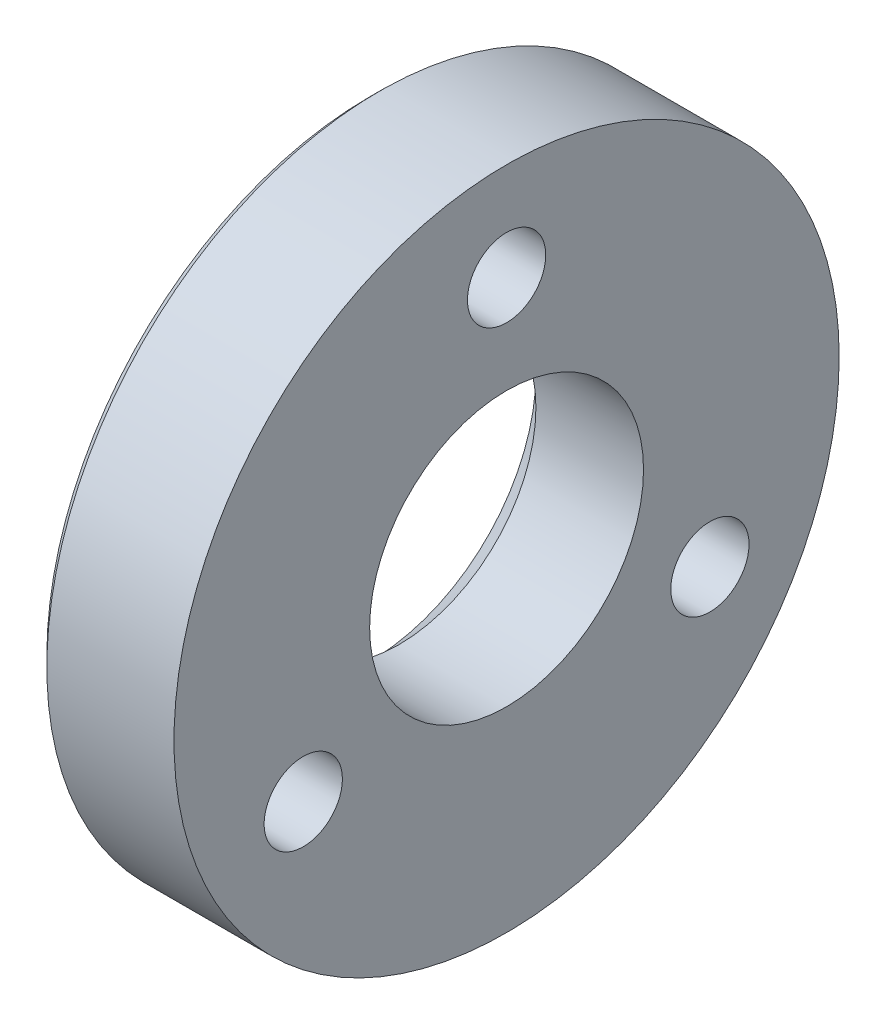
ISO-10303-21;
HEADER;
FILE_DESCRIPTION(('STEP AP214'),'2;1');
FILE_NAME('part.step','',(''),(''),'','','');
FILE_SCHEMA(('AUTOMOTIVE_DESIGN { 1 0 10303 214 1 1 1 1 }'));
ENDSEC;
DATA;
#1=APPLICATION_CONTEXT('core data for automotive mechanical design processes');
#2=APPLICATION_PROTOCOL_DEFINITION('international standard','automotive_design',2000,#1);
#3=PRODUCT_CONTEXT('',#1,'mechanical');
#4=PRODUCT('Part','Part','',(#3));
#5=PRODUCT_RELATED_PRODUCT_CATEGORY('part','',(#4));
#6=PRODUCT_DEFINITION_FORMATION('','',#4);
#7=PRODUCT_DEFINITION_CONTEXT('part definition',#1,'design');
#8=PRODUCT_DEFINITION('design','',#6,#7);
#9=PRODUCT_DEFINITION_SHAPE('','',#8);
#10=(LENGTH_UNIT() NAMED_UNIT(*) SI_UNIT(.MILLI.,.METRE.));
#11=(NAMED_UNIT(*) PLANE_ANGLE_UNIT() SI_UNIT($,.RADIAN.));
#12=(NAMED_UNIT(*) SI_UNIT($,.STERADIAN.) SOLID_ANGLE_UNIT());
#13=UNCERTAINTY_MEASURE_WITH_UNIT(LENGTH_MEASURE(1.E-05),#10,'distance_accuracy_value','');
#14=(GEOMETRIC_REPRESENTATION_CONTEXT(3) GLOBAL_UNCERTAINTY_ASSIGNED_CONTEXT((#13)) GLOBAL_UNIT_ASSIGNED_CONTEXT((#10,
#11,#12)) REPRESENTATION_CONTEXT('',''));
#15=CARTESIAN_POINT('',(0.,0.,0.));
#16=DIRECTION('',(0.,0.,1.));
#17=DIRECTION('',(1.,0.,0.));
#18=AXIS2_PLACEMENT_3D('',#15,#16,#17);
#19=CARTESIAN_POINT('',(-1.2E-05,-6.00000000000005,-10.3923048454132));
#20=DIRECTION('',(1.,0.,0.));
#21=DIRECTION('',(0.,0.,-1.));
#22=AXIS2_PLACEMENT_3D('',#19,#20,#21);
#23=CYLINDRICAL_SURFACE('',#22,2.);
#24=CARTESIAN_POINT('',(7.,-6.00000000000005,-10.3923048454132));
#25=DIRECTION('',(1.,0.,0.));
#26=DIRECTION('',(0.,0.,-1.));
#27=AXIS2_PLACEMENT_3D('',#24,#25,#26);
#28=CIRCLE('',#27,2.);
#29=CARTESIAN_POINT('',(7.,-6.00000000000005,-12.3923048454132));
#30=VERTEX_POINT('',#29);
#31=EDGE_CURVE('E64',#30,#30,#28,.T.);
#32=CARTESIAN_POINT('',(3.,-6.00000000000005,-10.3923048454132));
#33=DIRECTION('',(-1.,0.,0.));
#34=DIRECTION('',(0.,0.,1.));
#35=AXIS2_PLACEMENT_3D('',#32,#33,#34);
#36=CIRCLE('',#35,2.);
#37=CARTESIAN_POINT('',(3.,-6.00000000000005,-12.3923048454132));
#38=VERTEX_POINT('',#37);
#39=EDGE_CURVE('E68',#38,#38,#36,.F.);
#40=CARTESIAN_POINT('',(7.,-6.00000000000005,-12.3923048454132));
#41=CARTESIAN_POINT('',(6.95833333333333,-6.00000000000005,-12.3923048454132));
#42=CARTESIAN_POINT('',(6.91666666666667,-6.00000000000005,-12.3923048454132));
#43=CARTESIAN_POINT('',(6.83333333333333,-6.00000000000005,-12.3923048454132));
#44=CARTESIAN_POINT('',(6.79166666666667,-6.00000000000005,-12.3923048454132));
#45=CARTESIAN_POINT('',(6.70833333333333,-6.00000000000005,-12.3923048454132));
#46=CARTESIAN_POINT('',(6.66666666666667,-6.00000000000005,-12.3923048454132));
#47=CARTESIAN_POINT('',(6.58333333333333,-6.00000000000005,-12.3923048454132));
#48=CARTESIAN_POINT('',(6.54166666666667,-6.00000000000005,-12.3923048454132));
#49=CARTESIAN_POINT('',(6.45833333333333,-6.00000000000005,-12.3923048454132));
#50=CARTESIAN_POINT('',(6.41666666666667,-6.00000000000005,-12.3923048454132));
#51=CARTESIAN_POINT('',(6.33333333333333,-6.00000000000005,-12.3923048454132));
#52=CARTESIAN_POINT('',(6.29166666666667,-6.00000000000005,-12.3923048454132));
#53=CARTESIAN_POINT('',(6.20833333333333,-6.00000000000005,-12.3923048454132));
#54=CARTESIAN_POINT('',(6.16666666666667,-6.00000000000005,-12.3923048454132));
#55=CARTESIAN_POINT('',(6.08333333333333,-6.00000000000005,-12.3923048454132));
#56=CARTESIAN_POINT('',(6.04166666666667,-6.00000000000005,-12.3923048454132));
#57=CARTESIAN_POINT('',(5.95833333333333,-6.00000000000005,-12.3923048454132));
#58=CARTESIAN_POINT('',(5.91666666666667,-6.00000000000005,-12.3923048454132));
#59=CARTESIAN_POINT('',(5.83333333333333,-6.00000000000005,-12.3923048454132));
#60=CARTESIAN_POINT('',(5.79166666666667,-6.00000000000005,-12.3923048454132));
#61=CARTESIAN_POINT('',(5.70833333333333,-6.00000000000005,-12.3923048454132));
#62=CARTESIAN_POINT('',(5.66666666666667,-6.00000000000005,-12.3923048454132));
#63=CARTESIAN_POINT('',(5.58333333333333,-6.00000000000005,-12.3923048454132));
#64=CARTESIAN_POINT('',(5.54166666666667,-6.00000000000005,-12.3923048454132));
#65=CARTESIAN_POINT('',(5.45833333333333,-6.00000000000005,-12.3923048454132));
#66=CARTESIAN_POINT('',(5.41666666666667,-6.00000000000005,-12.3923048454132));
#67=CARTESIAN_POINT('',(5.33333333333333,-6.00000000000005,-12.3923048454132));
#68=CARTESIAN_POINT('',(5.29166666666667,-6.00000000000005,-12.3923048454132));
#69=CARTESIAN_POINT('',(5.20833333333333,-6.00000000000005,-12.3923048454132));
#70=CARTESIAN_POINT('',(5.16666666666667,-6.00000000000005,-12.3923048454132));
#71=CARTESIAN_POINT('',(5.08333333333333,-6.00000000000005,-12.3923048454132));
#72=CARTESIAN_POINT('',(5.04166666666667,-6.00000000000005,-12.3923048454132));
#73=CARTESIAN_POINT('',(4.95833333333333,-6.00000000000005,-12.3923048454132));
#74=CARTESIAN_POINT('',(4.91666666666667,-6.00000000000005,-12.3923048454132));
#75=CARTESIAN_POINT('',(4.83333333333333,-6.00000000000005,-12.3923048454132));
#76=CARTESIAN_POINT('',(4.79166666666667,-6.00000000000005,-12.3923048454132));
#77=CARTESIAN_POINT('',(4.70833333333333,-6.00000000000005,-12.3923048454132));
#78=CARTESIAN_POINT('',(4.66666666666667,-6.00000000000005,-12.3923048454132));
#79=CARTESIAN_POINT('',(4.58333333333333,-6.00000000000005,-12.3923048454132));
#80=CARTESIAN_POINT('',(4.54166666666667,-6.00000000000005,-12.3923048454132));
#81=CARTESIAN_POINT('',(4.45833333333333,-6.00000000000005,-12.3923048454132));
#82=CARTESIAN_POINT('',(4.41666666666667,-6.00000000000005,-12.3923048454132));
#83=CARTESIAN_POINT('',(4.33333333333333,-6.00000000000005,-12.3923048454132));
#84=CARTESIAN_POINT('',(4.29166666666667,-6.00000000000005,-12.3923048454132));
#85=CARTESIAN_POINT('',(4.20833333333333,-6.00000000000005,-12.3923048454132));
#86=CARTESIAN_POINT('',(4.16666666666667,-6.00000000000005,-12.3923048454132));
#87=CARTESIAN_POINT('',(4.08333333333333,-6.00000000000005,-12.3923048454132));
#88=CARTESIAN_POINT('',(4.04166666666667,-6.00000000000005,-12.3923048454132));
#89=CARTESIAN_POINT('',(3.95833333333333,-6.00000000000005,-12.3923048454132));
#90=CARTESIAN_POINT('',(3.91666666666667,-6.00000000000005,-12.3923048454132));
#91=CARTESIAN_POINT('',(3.83333333333333,-6.00000000000005,-12.3923048454132));
#92=CARTESIAN_POINT('',(3.79166666666667,-6.00000000000005,-12.3923048454132));
#93=CARTESIAN_POINT('',(3.70833333333333,-6.00000000000005,-12.3923048454132));
#94=CARTESIAN_POINT('',(3.66666666666667,-6.00000000000005,-12.3923048454132));
#95=CARTESIAN_POINT('',(3.58333333333333,-6.00000000000005,-12.3923048454132));
#96=CARTESIAN_POINT('',(3.54166666666667,-6.00000000000005,-12.3923048454132));
#97=CARTESIAN_POINT('',(3.45833333333333,-6.00000000000005,-12.3923048454132));
#98=CARTESIAN_POINT('',(3.41666666666667,-6.00000000000005,-12.3923048454132));
#99=CARTESIAN_POINT('',(3.33333333333333,-6.00000000000005,-12.3923048454132));
#100=CARTESIAN_POINT('',(3.29166666666667,-6.00000000000005,-12.3923048454132));
#101=CARTESIAN_POINT('',(3.20833333333333,-6.00000000000005,-12.3923048454132));
#102=CARTESIAN_POINT('',(3.16666666666667,-6.00000000000005,-12.3923048454132));
#103=CARTESIAN_POINT('',(3.08333333333333,-6.00000000000005,-12.3923048454132));
#104=CARTESIAN_POINT('',(3.04166666666667,-6.00000000000005,-12.3923048454132));
#105=CARTESIAN_POINT('',(3.,-6.00000000000005,-12.3923048454132));
#106=B_SPLINE_CURVE_WITH_KNOTS('',3,(#40,#41,#42,#43,#44,#45,#46,#47,#48,#49,#50,#51,#52,#53,
#54,#55,#56,#57,#58,#59,#60,#61,#62,#63,#64,#65,#66,#67,#68,#69,#70,#71,#72,#73,#74,#75,#76,#77,
#78,#79,#80,#81,#82,#83,#84,#85,#86,#87,#88,#89,#90,#91,#92,#93,#94,#95,#96,#97,#98,#99,#100,
#101,#102,#103,#104,#105),.UNSPECIFIED.,.F.,.F.,(4,2,2,2,2,2,2,2,2,2,2,2,2,2,2,2,2,2,2,2,2,2,2,
2,2,2,2,2,2,2,2,2,4),(0.,0.125,0.25,0.375,0.5,0.625,0.75,0.875,1.,1.125,1.25,1.375,1.5,1.625,
1.75,1.875,2.,2.125,2.25,2.375,2.5,2.625,2.75,2.875,3.,3.125,3.25,3.375,3.5,3.625,3.75,3.875,
4.),.UNSPECIFIED.);
#107=EDGE_CURVE('BSEAM39',#30,#38,#106,.T.);
#108=ORIENTED_EDGE('',*,*,#31,.T.);
#109=ORIENTED_EDGE('',*,*,#39,.F.);
#110=ORIENTED_EDGE('',*,*,#107,.T.);
#111=ORIENTED_EDGE('',*,*,#107,.F.);
#112=EDGE_LOOP('',(#108,#110,#109,#111));
#113=FACE_BOUND('',#112,.T.);
#114=ADVANCED_FACE('F39',(#113),#23,.F.);
#115=CARTESIAN_POINT('',(-1.2E-05,-5.99999999999991,10.3923048454133));
#116=DIRECTION('',(1.,0.,0.));
#117=DIRECTION('',(0.,0.,-1.));
#118=AXIS2_PLACEMENT_3D('',#115,#116,#117);
#119=CYLINDRICAL_SURFACE('',#118,2.);
#120=CARTESIAN_POINT('',(7.,-5.99999999999991,10.3923048454133));
#121=DIRECTION('',(1.,0.,0.));
#122=DIRECTION('',(0.,0.,-1.));
#123=AXIS2_PLACEMENT_3D('',#120,#121,#122);
#124=CIRCLE('',#123,2.);
#125=CARTESIAN_POINT('',(7.,-5.99999999999991,8.39230484541332));
#126=VERTEX_POINT('',#125);
#127=EDGE_CURVE('E90',#126,#126,#124,.T.);
#128=CARTESIAN_POINT('',(3.,-5.99999999999991,10.3923048454133));
#129=DIRECTION('',(-1.,0.,0.));
#130=DIRECTION('',(0.,0.,1.));
#131=AXIS2_PLACEMENT_3D('',#128,#129,#130);
#132=CIRCLE('',#131,2.);
#133=CARTESIAN_POINT('',(3.,-5.99999999999991,8.39230484541332));
#134=VERTEX_POINT('',#133);
#135=EDGE_CURVE('E65',#134,#134,#132,.F.);
#136=CARTESIAN_POINT('',(7.,-5.99999999999991,8.39230484541332));
#137=CARTESIAN_POINT('',(6.95833333333333,-5.99999999999991,8.39230484541332));
#138=CARTESIAN_POINT('',(6.91666666666667,-5.99999999999991,8.39230484541332));
#139=CARTESIAN_POINT('',(6.83333333333333,-5.99999999999991,8.39230484541332));
#140=CARTESIAN_POINT('',(6.79166666666667,-5.99999999999991,8.39230484541332));
#141=CARTESIAN_POINT('',(6.70833333333333,-5.99999999999991,8.39230484541332));
#142=CARTESIAN_POINT('',(6.66666666666667,-5.99999999999991,8.39230484541332));
#143=CARTESIAN_POINT('',(6.58333333333333,-5.99999999999991,8.39230484541332));
#144=CARTESIAN_POINT('',(6.54166666666667,-5.99999999999991,8.39230484541332));
#145=CARTESIAN_POINT('',(6.45833333333333,-5.99999999999991,8.39230484541332));
#146=CARTESIAN_POINT('',(6.41666666666667,-5.99999999999991,8.39230484541332));
#147=CARTESIAN_POINT('',(6.33333333333333,-5.99999999999991,8.39230484541332));
#148=CARTESIAN_POINT('',(6.29166666666667,-5.99999999999991,8.39230484541332));
#149=CARTESIAN_POINT('',(6.20833333333333,-5.99999999999991,8.39230484541332));
#150=CARTESIAN_POINT('',(6.16666666666667,-5.99999999999991,8.39230484541332));
#151=CARTESIAN_POINT('',(6.08333333333333,-5.99999999999991,8.39230484541332));
#152=CARTESIAN_POINT('',(6.04166666666667,-5.99999999999991,8.39230484541332));
#153=CARTESIAN_POINT('',(5.95833333333333,-5.99999999999991,8.39230484541332));
#154=CARTESIAN_POINT('',(5.91666666666667,-5.99999999999991,8.39230484541332));
#155=CARTESIAN_POINT('',(5.83333333333333,-5.99999999999991,8.39230484541332));
#156=CARTESIAN_POINT('',(5.79166666666667,-5.99999999999991,8.39230484541332));
#157=CARTESIAN_POINT('',(5.70833333333333,-5.99999999999991,8.39230484541332));
#158=CARTESIAN_POINT('',(5.66666666666667,-5.99999999999991,8.39230484541332));
#159=CARTESIAN_POINT('',(5.58333333333333,-5.99999999999991,8.39230484541332));
#160=CARTESIAN_POINT('',(5.54166666666667,-5.99999999999991,8.39230484541332));
#161=CARTESIAN_POINT('',(5.45833333333333,-5.99999999999991,8.39230484541332));
#162=CARTESIAN_POINT('',(5.41666666666667,-5.99999999999991,8.39230484541332));
#163=CARTESIAN_POINT('',(5.33333333333333,-5.99999999999991,8.39230484541332));
#164=CARTESIAN_POINT('',(5.29166666666667,-5.99999999999991,8.39230484541332));
#165=CARTESIAN_POINT('',(5.20833333333333,-5.99999999999991,8.39230484541332));
#166=CARTESIAN_POINT('',(5.16666666666667,-5.99999999999991,8.39230484541332));
#167=CARTESIAN_POINT('',(5.08333333333333,-5.99999999999991,8.39230484541332));
#168=CARTESIAN_POINT('',(5.04166666666667,-5.99999999999991,8.39230484541332));
#169=CARTESIAN_POINT('',(4.95833333333333,-5.99999999999991,8.39230484541332));
#170=CARTESIAN_POINT('',(4.91666666666667,-5.99999999999991,8.39230484541332));
#171=CARTESIAN_POINT('',(4.83333333333333,-5.99999999999991,8.39230484541332));
#172=CARTESIAN_POINT('',(4.79166666666667,-5.99999999999991,8.39230484541332));
#173=CARTESIAN_POINT('',(4.70833333333333,-5.99999999999991,8.39230484541332));
#174=CARTESIAN_POINT('',(4.66666666666667,-5.99999999999991,8.39230484541332));
#175=CARTESIAN_POINT('',(4.58333333333333,-5.99999999999991,8.39230484541332));
#176=CARTESIAN_POINT('',(4.54166666666667,-5.99999999999991,8.39230484541332));
#177=CARTESIAN_POINT('',(4.45833333333333,-5.99999999999991,8.39230484541332));
#178=CARTESIAN_POINT('',(4.41666666666667,-5.99999999999991,8.39230484541332));
#179=CARTESIAN_POINT('',(4.33333333333333,-5.99999999999991,8.39230484541332));
#180=CARTESIAN_POINT('',(4.29166666666667,-5.99999999999991,8.39230484541332));
#181=CARTESIAN_POINT('',(4.20833333333333,-5.99999999999991,8.39230484541332));
#182=CARTESIAN_POINT('',(4.16666666666667,-5.99999999999991,8.39230484541332));
#183=CARTESIAN_POINT('',(4.08333333333333,-5.99999999999991,8.39230484541332));
#184=CARTESIAN_POINT('',(4.04166666666667,-5.99999999999991,8.39230484541332));
#185=CARTESIAN_POINT('',(3.95833333333333,-5.99999999999991,8.39230484541332));
#186=CARTESIAN_POINT('',(3.91666666666667,-5.99999999999991,8.39230484541332));
#187=CARTESIAN_POINT('',(3.83333333333333,-5.99999999999991,8.39230484541332));
#188=CARTESIAN_POINT('',(3.79166666666667,-5.99999999999991,8.39230484541332));
#189=CARTESIAN_POINT('',(3.70833333333333,-5.99999999999991,8.39230484541332));
#190=CARTESIAN_POINT('',(3.66666666666667,-5.99999999999991,8.39230484541332));
#191=CARTESIAN_POINT('',(3.58333333333333,-5.99999999999991,8.39230484541332));
#192=CARTESIAN_POINT('',(3.54166666666667,-5.99999999999991,8.39230484541332));
#193=CARTESIAN_POINT('',(3.45833333333333,-5.99999999999991,8.39230484541332));
#194=CARTESIAN_POINT('',(3.41666666666667,-5.99999999999991,8.39230484541332));
#195=CARTESIAN_POINT('',(3.33333333333333,-5.99999999999991,8.39230484541332));
#196=CARTESIAN_POINT('',(3.29166666666667,-5.99999999999991,8.39230484541332));
#197=CARTESIAN_POINT('',(3.20833333333333,-5.99999999999991,8.39230484541332));
#198=CARTESIAN_POINT('',(3.16666666666667,-5.99999999999991,8.39230484541332));
#199=CARTESIAN_POINT('',(3.08333333333333,-5.99999999999991,8.39230484541332));
#200=CARTESIAN_POINT('',(3.04166666666667,-5.99999999999991,8.39230484541332));
#201=CARTESIAN_POINT('',(3.,-5.99999999999991,8.39230484541332));
#202=B_SPLINE_CURVE_WITH_KNOTS('',3,(#136,#137,#138,#139,#140,#141,#142,#143,#144,#145,#146,
#147,#148,#149,#150,#151,#152,#153,#154,#155,#156,#157,#158,#159,#160,#161,#162,#163,#164,#165,
#166,#167,#168,#169,#170,#171,#172,#173,#174,#175,#176,#177,#178,#179,#180,#181,#182,#183,#184,
#185,#186,#187,#188,#189,#190,#191,#192,#193,#194,#195,#196,#197,#198,#199,#200,#201),
.UNSPECIFIED.,.F.,.F.,(4,2,2,2,2,2,2,2,2,2,2,2,2,2,2,2,2,2,2,2,2,2,2,2,2,2,2,2,2,2,2,2,4),(0.,
0.125,0.25,0.375,0.5,0.625,0.75,0.875,1.,1.125,1.25,1.375,1.5,1.625,1.75,1.875,2.,2.125,2.25,
2.375,2.5,2.625,2.75,2.875,3.,3.125,3.25,3.375,3.5,3.625,3.75,3.875,4.),.UNSPECIFIED.);
#203=EDGE_CURVE('BSEAM134',#126,#134,#202,.T.);
#204=ORIENTED_EDGE('',*,*,#127,.T.);
#205=ORIENTED_EDGE('',*,*,#135,.F.);
#206=ORIENTED_EDGE('',*,*,#203,.T.);
#207=ORIENTED_EDGE('',*,*,#203,.F.);
#208=EDGE_LOOP('',(#204,#206,#205,#207));
#209=FACE_BOUND('',#208,.T.);
#210=ADVANCED_FACE('F134',(#209),#119,.F.);
#211=CARTESIAN_POINT('',(-1.2E-05,12.,0.));
#212=DIRECTION('',(1.,0.,0.));
#213=DIRECTION('',(0.,0.,-1.));
#214=AXIS2_PLACEMENT_3D('',#211,#212,#213);
#215=CYLINDRICAL_SURFACE('',#214,2.);
#216=CARTESIAN_POINT('',(7.,12.,0.));
#217=DIRECTION('',(1.,0.,0.));
#218=DIRECTION('',(0.,0.,-1.));
#219=AXIS2_PLACEMENT_3D('',#216,#217,#218);
#220=CIRCLE('',#219,2.);
#221=CARTESIAN_POINT('',(7.,12.,-2.));
#222=VERTEX_POINT('',#221);
#223=EDGE_CURVE('E86',#222,#222,#220,.T.);
#224=CARTESIAN_POINT('',(3.,12.,0.));
#225=DIRECTION('',(-1.,0.,0.));
#226=DIRECTION('',(0.,0.,1.));
#227=AXIS2_PLACEMENT_3D('',#224,#225,#226);
#228=CIRCLE('',#227,2.);
#229=CARTESIAN_POINT('',(3.,12.,-2.));
#230=VERTEX_POINT('',#229);
#231=EDGE_CURVE('E57',#230,#230,#228,.F.);
#232=CARTESIAN_POINT('',(7.,12.,-2.));
#233=CARTESIAN_POINT('',(6.95833333333333,12.,-2.));
#234=CARTESIAN_POINT('',(6.91666666666667,12.,-2.));
#235=CARTESIAN_POINT('',(6.83333333333333,12.,-2.));
#236=CARTESIAN_POINT('',(6.79166666666667,12.,-2.));
#237=CARTESIAN_POINT('',(6.70833333333333,12.,-2.));
#238=CARTESIAN_POINT('',(6.66666666666667,12.,-2.));
#239=CARTESIAN_POINT('',(6.58333333333333,12.,-2.));
#240=CARTESIAN_POINT('',(6.54166666666667,12.,-2.));
#241=CARTESIAN_POINT('',(6.45833333333333,12.,-2.));
#242=CARTESIAN_POINT('',(6.41666666666667,12.,-2.));
#243=CARTESIAN_POINT('',(6.33333333333333,12.,-2.));
#244=CARTESIAN_POINT('',(6.29166666666667,12.,-2.));
#245=CARTESIAN_POINT('',(6.20833333333333,12.,-2.));
#246=CARTESIAN_POINT('',(6.16666666666667,12.,-2.));
#247=CARTESIAN_POINT('',(6.08333333333333,12.,-2.));
#248=CARTESIAN_POINT('',(6.04166666666667,12.,-2.));
#249=CARTESIAN_POINT('',(5.95833333333333,12.,-2.));
#250=CARTESIAN_POINT('',(5.91666666666667,12.,-2.));
#251=CARTESIAN_POINT('',(5.83333333333333,12.,-2.));
#252=CARTESIAN_POINT('',(5.79166666666667,12.,-2.));
#253=CARTESIAN_POINT('',(5.70833333333333,12.,-2.));
#254=CARTESIAN_POINT('',(5.66666666666667,12.,-2.));
#255=CARTESIAN_POINT('',(5.58333333333333,12.,-2.));
#256=CARTESIAN_POINT('',(5.54166666666667,12.,-2.));
#257=CARTESIAN_POINT('',(5.45833333333333,12.,-2.));
#258=CARTESIAN_POINT('',(5.41666666666667,12.,-2.));
#259=CARTESIAN_POINT('',(5.33333333333333,12.,-2.));
#260=CARTESIAN_POINT('',(5.29166666666667,12.,-2.));
#261=CARTESIAN_POINT('',(5.20833333333333,12.,-2.));
#262=CARTESIAN_POINT('',(5.16666666666667,12.,-2.));
#263=CARTESIAN_POINT('',(5.08333333333333,12.,-2.));
#264=CARTESIAN_POINT('',(5.04166666666667,12.,-2.));
#265=CARTESIAN_POINT('',(4.95833333333333,12.,-2.));
#266=CARTESIAN_POINT('',(4.91666666666667,12.,-2.));
#267=CARTESIAN_POINT('',(4.83333333333333,12.,-2.));
#268=CARTESIAN_POINT('',(4.79166666666667,12.,-2.));
#269=CARTESIAN_POINT('',(4.70833333333333,12.,-2.));
#270=CARTESIAN_POINT('',(4.66666666666667,12.,-2.));
#271=CARTESIAN_POINT('',(4.58333333333333,12.,-2.));
#272=CARTESIAN_POINT('',(4.54166666666667,12.,-2.));
#273=CARTESIAN_POINT('',(4.45833333333333,12.,-2.));
#274=CARTESIAN_POINT('',(4.41666666666667,12.,-2.));
#275=CARTESIAN_POINT('',(4.33333333333333,12.,-2.));
#276=CARTESIAN_POINT('',(4.29166666666667,12.,-2.));
#277=CARTESIAN_POINT('',(4.20833333333333,12.,-2.));
#278=CARTESIAN_POINT('',(4.16666666666667,12.,-2.));
#279=CARTESIAN_POINT('',(4.08333333333333,12.,-2.));
#280=CARTESIAN_POINT('',(4.04166666666667,12.,-2.));
#281=CARTESIAN_POINT('',(3.95833333333333,12.,-2.));
#282=CARTESIAN_POINT('',(3.91666666666667,12.,-2.));
#283=CARTESIAN_POINT('',(3.83333333333333,12.,-2.));
#284=CARTESIAN_POINT('',(3.79166666666667,12.,-2.));
#285=CARTESIAN_POINT('',(3.70833333333333,12.,-2.));
#286=CARTESIAN_POINT('',(3.66666666666667,12.,-2.));
#287=CARTESIAN_POINT('',(3.58333333333333,12.,-2.));
#288=CARTESIAN_POINT('',(3.54166666666667,12.,-2.));
#289=CARTESIAN_POINT('',(3.45833333333333,12.,-2.));
#290=CARTESIAN_POINT('',(3.41666666666667,12.,-2.));
#291=CARTESIAN_POINT('',(3.33333333333333,12.,-2.));
#292=CARTESIAN_POINT('',(3.29166666666667,12.,-2.));
#293=CARTESIAN_POINT('',(3.20833333333333,12.,-2.));
#294=CARTESIAN_POINT('',(3.16666666666667,12.,-2.));
#295=CARTESIAN_POINT('',(3.08333333333333,12.,-2.));
#296=CARTESIAN_POINT('',(3.04166666666667,12.,-2.));
#297=CARTESIAN_POINT('',(3.,12.,-2.));
#298=B_SPLINE_CURVE_WITH_KNOTS('',3,(#232,#233,#234,#235,#236,#237,#238,#239,#240,#241,#242,
#243,#244,#245,#246,#247,#248,#249,#250,#251,#252,#253,#254,#255,#256,#257,#258,#259,#260,#261,
#262,#263,#264,#265,#266,#267,#268,#269,#270,#271,#272,#273,#274,#275,#276,#277,#278,#279,#280,
#281,#282,#283,#284,#285,#286,#287,#288,#289,#290,#291,#292,#293,#294,#295,#296,#297),
.UNSPECIFIED.,.F.,.F.,(4,2,2,2,2,2,2,2,2,2,2,2,2,2,2,2,2,2,2,2,2,2,2,2,2,2,2,2,2,2,2,2,4),(0.,
0.125,0.25,0.375,0.5,0.625,0.75,0.875,1.,1.125,1.25,1.375,1.5,1.625,1.75,1.875,2.,2.125,2.25,
2.375,2.5,2.625,2.75,2.875,3.,3.125,3.25,3.375,3.5,3.625,3.75,3.875,4.),.UNSPECIFIED.);
#299=EDGE_CURVE('BSEAM122',#222,#230,#298,.T.);
#300=ORIENTED_EDGE('',*,*,#223,.T.);
#301=ORIENTED_EDGE('',*,*,#231,.F.);
#302=ORIENTED_EDGE('',*,*,#299,.T.);
#303=ORIENTED_EDGE('',*,*,#299,.F.);
#304=EDGE_LOOP('',(#300,#302,#301,#303));
#305=FACE_BOUND('',#304,.T.);
#306=ADVANCED_FACE('F122',(#305),#215,.F.);
#307=CARTESIAN_POINT('',(7.,0.,0.));
#308=DIRECTION('',(1.,0.,0.));
#309=DIRECTION('',(0.,0.,-1.));
#310=AXIS2_PLACEMENT_3D('',#307,#308,#309);
#311=PLANE('',#310);
#312=ORIENTED_EDGE('',*,*,#223,.F.);
#313=EDGE_LOOP('',(#312));
#314=FACE_BOUND('',#313,.T.);
#315=ORIENTED_EDGE('',*,*,#127,.F.);
#316=EDGE_LOOP('',(#315));
#317=FACE_BOUND('',#316,.T.);
#318=ORIENTED_EDGE('',*,*,#31,.F.);
#319=EDGE_LOOP('',(#318));
#320=FACE_BOUND('',#319,.T.);
#321=CARTESIAN_POINT('',(7.,0.,0.));
#322=DIRECTION('',(1.,0.,0.));
#323=DIRECTION('',(0.,0.,-1.));
#324=AXIS2_PLACEMENT_3D('',#321,#322,#323);
#325=CIRCLE('',#324,17.);
#326=CARTESIAN_POINT('',(7.,0.,-17.));
#327=VERTEX_POINT('',#326);
#328=EDGE_CURVE('E97',#327,#327,#325,.T.);
#329=ORIENTED_EDGE('',*,*,#328,.T.);
#330=EDGE_LOOP('',(#329));
#331=FACE_BOUND('',#330,.T.);
#332=CARTESIAN_POINT('',(7.,0.,0.));
#333=DIRECTION('',(1.,0.,0.));
#334=DIRECTION('',(0.,0.,-1.));
#335=AXIS2_PLACEMENT_3D('',#332,#333,#334);
#336=CIRCLE('',#335,7.);
#337=CARTESIAN_POINT('',(7.,0.,-7.));
#338=VERTEX_POINT('',#337);
#339=EDGE_CURVE('E89',#338,#338,#336,.T.);
#340=ORIENTED_EDGE('',*,*,#339,.F.);
#341=EDGE_LOOP('',(#340));
#342=FACE_BOUND('',#341,.T.);
#343=ADVANCED_FACE('F119',(#314,#317,#320,#331,#342),#311,.T.);
#344=CARTESIAN_POINT('',(0.,0.,0.));
#345=DIRECTION('',(1.,0.,0.));
#346=DIRECTION('',(0.,0.,-1.));
#347=AXIS2_PLACEMENT_3D('',#344,#345,#346);
#348=PLANE('',#347);
#349=CARTESIAN_POINT('',(0.,-6.00000000000005,10.3923048454132));
#350=DIRECTION('',(1.,0.,0.));
#351=DIRECTION('',(0.,0.,-1.));
#352=AXIS2_PLACEMENT_3D('',#349,#350,#351);
#353=CIRCLE('',#352,3.);
#354=CARTESIAN_POINT('',(0.,-6.00000000000005,7.39230484541324));
#355=VERTEX_POINT('',#354);
#356=EDGE_CURVE('E44',#355,#355,#353,.F.);
#357=ORIENTED_EDGE('',*,*,#356,.F.);
#358=EDGE_LOOP('',(#357));
#359=FACE_BOUND('',#358,.T.);
#360=CARTESIAN_POINT('',(0.,-5.9999999999999,-10.3923048454133));
#361=DIRECTION('',(1.,0.,0.));
#362=DIRECTION('',(0.,0.,-1.));
#363=AXIS2_PLACEMENT_3D('',#360,#361,#362);
#364=CIRCLE('',#363,3.);
#365=CARTESIAN_POINT('',(0.,-5.9999999999999,-13.3923048454133));
#366=VERTEX_POINT('',#365);
#367=EDGE_CURVE('E71',#366,#366,#364,.F.);
#368=ORIENTED_EDGE('',*,*,#367,.F.);
#369=EDGE_LOOP('',(#368));
#370=FACE_BOUND('',#369,.T.);
#371=CARTESIAN_POINT('',(0.,12.,0.));
#372=DIRECTION('',(1.,0.,0.));
#373=DIRECTION('',(0.,0.,-1.));
#374=AXIS2_PLACEMENT_3D('',#371,#372,#373);
#375=CIRCLE('',#374,3.);
#376=CARTESIAN_POINT('',(0.,12.,-3.));
#377=VERTEX_POINT('',#376);
#378=EDGE_CURVE('E60',#377,#377,#375,.F.);
#379=ORIENTED_EDGE('',*,*,#378,.F.);
#380=EDGE_LOOP('',(#379));
#381=FACE_BOUND('',#380,.T.);
#382=CARTESIAN_POINT('',(0.,0.,0.));
#383=DIRECTION('',(1.,0.,0.));
#384=DIRECTION('',(0.,0.,-1.));
#385=AXIS2_PLACEMENT_3D('',#382,#383,#384);
#386=CIRCLE('',#385,8.50000000000001);
#387=CARTESIAN_POINT('',(0.,0.,-8.50000000000001));
#388=VERTEX_POINT('',#387);
#389=EDGE_CURVE('E48',#388,#388,#386,.T.);
#390=ORIENTED_EDGE('',*,*,#389,.T.);
#391=EDGE_LOOP('',(#390));
#392=FACE_BOUND('',#391,.T.);
#393=CARTESIAN_POINT('',(0.,0.,0.));
#394=DIRECTION('',(1.,0.,0.));
#395=DIRECTION('',(0.,0.,-1.));
#396=AXIS2_PLACEMENT_3D('',#393,#394,#395);
#397=CIRCLE('',#396,16.5);
#398=CARTESIAN_POINT('',(0.,0.,-16.5));
#399=VERTEX_POINT('',#398);
#400=EDGE_CURVE('E53',#399,#399,#397,.F.);
#401=ORIENTED_EDGE('',*,*,#400,.T.);
#402=EDGE_LOOP('',(#401));
#403=FACE_BOUND('',#402,.T.);
#404=ADVANCED_FACE('F105',(#359,#370,#381,#392,#403),#348,.F.);
#405=CARTESIAN_POINT('',(7.,0.,0.));
#406=DIRECTION('',(-1.,0.,0.));
#407=DIRECTION('',(0.,0.,1.));
#408=AXIS2_PLACEMENT_3D('',#405,#406,#407);
#409=CYLINDRICAL_SURFACE('',#408,17.);
#410=CARTESIAN_POINT('',(0.5,0.,0.));
#411=DIRECTION('',(1.,0.,0.));
#412=DIRECTION('',(0.,0.,-1.));
#413=AXIS2_PLACEMENT_3D('',#410,#411,#412);
#414=CIRCLE('',#413,17.);
#415=CARTESIAN_POINT('',(0.5,0.,-17.));
#416=VERTEX_POINT('',#415);
#417=EDGE_CURVE('E100',#416,#416,#414,.T.);
#418=ORIENTED_EDGE('',*,*,#417,.T.);
#419=EDGE_LOOP('',(#418));
#420=FACE_BOUND('',#419,.T.);
#421=ORIENTED_EDGE('',*,*,#328,.F.);
#422=EDGE_LOOP('',(#421));
#423=FACE_BOUND('',#422,.T.);
#424=ADVANCED_FACE('F113',(#420,#423),#409,.T.);
#425=CARTESIAN_POINT('',(7.,0.,0.));
#426=DIRECTION('',(-1.,0.,0.));
#427=DIRECTION('',(0.,0.,1.));
#428=AXIS2_PLACEMENT_3D('',#425,#426,#427);
#429=CYLINDRICAL_SURFACE('',#428,7.);
#430=CARTESIAN_POINT('',(1.50000000000001,0.,0.));
#431=DIRECTION('',(1.,0.,0.));
#432=DIRECTION('',(0.,0.,-1.));
#433=AXIS2_PLACEMENT_3D('',#430,#431,#432);
#434=CIRCLE('',#433,7.);
#435=CARTESIAN_POINT('',(1.50000000000001,0.,-7.));
#436=VERTEX_POINT('',#435);
#437=EDGE_CURVE('E10',#436,#436,#434,.F.);
#438=ORIENTED_EDGE('',*,*,#437,.T.);
#439=EDGE_LOOP('',(#438));
#440=FACE_BOUND('',#439,.T.);
#441=ORIENTED_EDGE('',*,*,#339,.T.);
#442=EDGE_LOOP('',(#441));
#443=FACE_BOUND('',#442,.T.);
#444=ADVANCED_FACE('F110',(#440,#443),#429,.F.);
#445=CARTESIAN_POINT('',(0.5,0.,0.));
#446=DIRECTION('',(1.,0.,0.));
#447=DIRECTION('',(0.,0.,-1.));
#448=AXIS2_PLACEMENT_3D('',#445,#446,#447);
#449=CONICAL_SURFACE('',#448,17.,0.785398163397452);
#450=ORIENTED_EDGE('',*,*,#400,.F.);
#451=EDGE_LOOP('',(#450));
#452=FACE_BOUND('',#451,.T.);
#453=ORIENTED_EDGE('',*,*,#417,.F.);
#454=EDGE_LOOP('',(#453));
#455=FACE_BOUND('',#454,.T.);
#456=ADVANCED_FACE('F107',(#452,#455),#449,.T.);
#457=CARTESIAN_POINT('',(0.,0.,0.));
#458=DIRECTION('',(-1.,0.,0.));
#459=DIRECTION('',(0.,0.,1.));
#460=AXIS2_PLACEMENT_3D('',#457,#458,#459);
#461=CONICAL_SURFACE('',#460,8.50000000000001,0.785398163397447);
#462=ORIENTED_EDGE('',*,*,#437,.F.);
#463=EDGE_LOOP('',(#462));
#464=FACE_BOUND('',#463,.T.);
#465=ORIENTED_EDGE('',*,*,#389,.F.);
#466=EDGE_LOOP('',(#465));
#467=FACE_BOUND('',#466,.T.);
#468=ADVANCED_FACE('F42',(#464,#467),#461,.F.);
#469=CARTESIAN_POINT('',(-1.2E-05,12.,0.));
#470=DIRECTION('',(1.,0.,0.));
#471=DIRECTION('',(0.,0.,-1.));
#472=AXIS2_PLACEMENT_3D('',#469,#470,#471);
#473=CYLINDRICAL_SURFACE('',#472,3.);
#474=CARTESIAN_POINT('',(3.,12.,0.));
#475=DIRECTION('',(-1.,0.,0.));
#476=DIRECTION('',(0.,0.,1.));
#477=AXIS2_PLACEMENT_3D('',#474,#475,#476);
#478=CIRCLE('',#477,3.);
#479=CARTESIAN_POINT('',(3.,12.,-3.));
#480=VERTEX_POINT('',#479);
#481=EDGE_CURVE('E61',#480,#480,#478,.T.);
#482=CARTESIAN_POINT('',(3.,12.,-3.));
#483=CARTESIAN_POINT('',(2.96875,12.,-3.));
#484=CARTESIAN_POINT('',(2.9375,12.,-3.));
#485=CARTESIAN_POINT('',(2.875,12.,-3.));
#486=CARTESIAN_POINT('',(2.84375,12.,-3.));
#487=CARTESIAN_POINT('',(2.78125,12.,-3.));
#488=CARTESIAN_POINT('',(2.75,12.,-3.));
#489=CARTESIAN_POINT('',(2.6875,12.,-3.));
#490=CARTESIAN_POINT('',(2.65625,12.,-3.));
#491=CARTESIAN_POINT('',(2.59375,12.,-3.));
#492=CARTESIAN_POINT('',(2.5625,12.,-3.));
#493=CARTESIAN_POINT('',(2.5,12.,-3.));
#494=CARTESIAN_POINT('',(2.46875,12.,-3.));
#495=CARTESIAN_POINT('',(2.40625,12.,-3.));
#496=CARTESIAN_POINT('',(2.375,12.,-3.));
#497=CARTESIAN_POINT('',(2.3125,12.,-3.));
#498=CARTESIAN_POINT('',(2.28125,12.,-3.));
#499=CARTESIAN_POINT('',(2.21875,12.,-3.));
#500=CARTESIAN_POINT('',(2.1875,12.,-3.));
#501=CARTESIAN_POINT('',(2.125,12.,-3.));
#502=CARTESIAN_POINT('',(2.09375,12.,-3.));
#503=CARTESIAN_POINT('',(2.03125,12.,-3.));
#504=CARTESIAN_POINT('',(2.,12.,-3.));
#505=CARTESIAN_POINT('',(1.9375,12.,-3.));
#506=CARTESIAN_POINT('',(1.90625,12.,-3.));
#507=CARTESIAN_POINT('',(1.84375,12.,-3.));
#508=CARTESIAN_POINT('',(1.8125,12.,-3.));
#509=CARTESIAN_POINT('',(1.75,12.,-3.));
#510=CARTESIAN_POINT('',(1.71875,12.,-3.));
#511=CARTESIAN_POINT('',(1.65625,12.,-3.));
#512=CARTESIAN_POINT('',(1.625,12.,-3.));
#513=CARTESIAN_POINT('',(1.5625,12.,-3.));
#514=CARTESIAN_POINT('',(1.53125,12.,-3.));
#515=CARTESIAN_POINT('',(1.46875,12.,-3.));
#516=CARTESIAN_POINT('',(1.4375,12.,-3.));
#517=CARTESIAN_POINT('',(1.375,12.,-3.));
#518=CARTESIAN_POINT('',(1.34375,12.,-3.));
#519=CARTESIAN_POINT('',(1.28125,12.,-3.));
#520=CARTESIAN_POINT('',(1.25,12.,-3.));
#521=CARTESIAN_POINT('',(1.1875,12.,-3.));
#522=CARTESIAN_POINT('',(1.15625,12.,-3.));
#523=CARTESIAN_POINT('',(1.09375,12.,-3.));
#524=CARTESIAN_POINT('',(1.0625,12.,-3.));
#525=CARTESIAN_POINT('',(1.,12.,-3.));
#526=CARTESIAN_POINT('',(0.96875,12.,-3.));
#527=CARTESIAN_POINT('',(0.90625,12.,-3.));
#528=CARTESIAN_POINT('',(0.875,12.,-3.));
#529=CARTESIAN_POINT('',(0.8125,12.,-3.));
#530=CARTESIAN_POINT('',(0.78125,12.,-3.));
#531=CARTESIAN_POINT('',(0.71875,12.,-3.));
#532=CARTESIAN_POINT('',(0.6875,12.,-3.));
#533=CARTESIAN_POINT('',(0.625,12.,-3.));
#534=CARTESIAN_POINT('',(0.59375,12.,-3.));
#535=CARTESIAN_POINT('',(0.53125,12.,-3.));
#536=CARTESIAN_POINT('',(0.5,12.,-3.));
#537=CARTESIAN_POINT('',(0.4375,12.,-3.));
#538=CARTESIAN_POINT('',(0.40625,12.,-3.));
#539=CARTESIAN_POINT('',(0.34375,12.,-3.));
#540=CARTESIAN_POINT('',(0.3125,12.,-3.));
#541=CARTESIAN_POINT('',(0.25,12.,-3.));
#542=CARTESIAN_POINT('',(0.21875,12.,-3.));
#543=CARTESIAN_POINT('',(0.15625,12.,-3.));
#544=CARTESIAN_POINT('',(0.125,12.,-3.));
#545=CARTESIAN_POINT('',(0.0625000000000002,12.,-3.));
#546=CARTESIAN_POINT('',(0.0312500000000002,12.,-3.));
#547=CARTESIAN_POINT('',(0.,12.,-3.));
#548=B_SPLINE_CURVE_WITH_KNOTS('',3,(#482,#483,#484,#485,#486,#487,#488,#489,#490,#491,#492,
#493,#494,#495,#496,#497,#498,#499,#500,#501,#502,#503,#504,#505,#506,#507,#508,#509,#510,#511,
#512,#513,#514,#515,#516,#517,#518,#519,#520,#521,#522,#523,#524,#525,#526,#527,#528,#529,#530,
#531,#532,#533,#534,#535,#536,#537,#538,#539,#540,#541,#542,#543,#544,#545,#546,#547),
.UNSPECIFIED.,.F.,.F.,(4,2,2,2,2,2,2,2,2,2,2,2,2,2,2,2,2,2,2,2,2,2,2,2,2,2,2,2,2,2,2,2,4),(0.,
0.0937500000000001,0.1875,0.28125,0.375,0.46875,0.5625,0.65625,0.75,0.84375,0.9375,1.03125,
1.125,1.21875,1.3125,1.40625,1.5,1.59375,1.6875,1.78125,1.875,1.96875,2.0625,2.15625,2.25,
2.34375,2.4375,2.53125,2.625,2.71875,2.8125,2.90625,3.),.UNSPECIFIED.);
#549=EDGE_CURVE('BSEAM147',#480,#377,#548,.T.);
#550=ORIENTED_EDGE('',*,*,#481,.F.);
#551=ORIENTED_EDGE('',*,*,#378,.T.);
#552=ORIENTED_EDGE('',*,*,#549,.T.);
#553=ORIENTED_EDGE('',*,*,#549,.F.);
#554=EDGE_LOOP('',(#550,#552,#551,#553));
#555=FACE_BOUND('',#554,.T.);
#556=ADVANCED_FACE('F147',(#555),#473,.F.);
#557=CARTESIAN_POINT('',(3.,12.,0.));
#558=DIRECTION('',(-1.,0.,0.));
#559=DIRECTION('',(0.,0.,1.));
#560=AXIS2_PLACEMENT_3D('',#557,#558,#559);
#561=PLANE('',#560);
#562=ORIENTED_EDGE('',*,*,#481,.T.);
#563=EDGE_LOOP('',(#562));
#564=FACE_BOUND('',#563,.T.);
#565=ORIENTED_EDGE('',*,*,#231,.T.);
#566=EDGE_LOOP('',(#565));
#567=FACE_BOUND('',#566,.T.);
#568=ADVANCED_FACE('F150',(#564,#567),#561,.T.);
#569=CARTESIAN_POINT('',(-1.2E-05,-6.00000000000005,10.3923048454132));
#570=DIRECTION('',(1.,0.,0.));
#571=DIRECTION('',(0.,0.,-1.));
#572=AXIS2_PLACEMENT_3D('',#569,#570,#571);
#573=CYLINDRICAL_SURFACE('',#572,3.);
#574=CARTESIAN_POINT('',(3.,-6.00000000000005,10.3923048454132));
#575=DIRECTION('',(-1.,0.,0.));
#576=DIRECTION('',(0.,-0.866025403784436,-0.500000000000004));
#577=AXIS2_PLACEMENT_3D('',#574,#575,#576);
#578=CIRCLE('',#577,3.);
#579=CARTESIAN_POINT('',(3.,-6.00000000000005,7.39230484541324));
#580=VERTEX_POINT('',#579);
#581=EDGE_CURVE('E69',#580,#580,#578,.T.);
#582=CARTESIAN_POINT('',(3.,-6.00000000000005,7.39230484541324));
#583=CARTESIAN_POINT('',(2.96875,-6.00000000000005,7.39230484541324));
#584=CARTESIAN_POINT('',(2.9375,-6.00000000000005,7.39230484541324));
#585=CARTESIAN_POINT('',(2.875,-6.00000000000005,7.39230484541324));
#586=CARTESIAN_POINT('',(2.84375,-6.00000000000005,7.39230484541324));
#587=CARTESIAN_POINT('',(2.78125,-6.00000000000005,7.39230484541324));
#588=CARTESIAN_POINT('',(2.75,-6.00000000000005,7.39230484541324));
#589=CARTESIAN_POINT('',(2.6875,-6.00000000000005,7.39230484541324));
#590=CARTESIAN_POINT('',(2.65625,-6.00000000000005,7.39230484541324));
#591=CARTESIAN_POINT('',(2.59375,-6.00000000000005,7.39230484541324));
#592=CARTESIAN_POINT('',(2.5625,-6.00000000000005,7.39230484541324));
#593=CARTESIAN_POINT('',(2.5,-6.00000000000005,7.39230484541324));
#594=CARTESIAN_POINT('',(2.46875,-6.00000000000005,7.39230484541324));
#595=CARTESIAN_POINT('',(2.40625,-6.00000000000005,7.39230484541324));
#596=CARTESIAN_POINT('',(2.375,-6.00000000000005,7.39230484541324));
#597=CARTESIAN_POINT('',(2.3125,-6.00000000000005,7.39230484541324));
#598=CARTESIAN_POINT('',(2.28125,-6.00000000000005,7.39230484541324));
#599=CARTESIAN_POINT('',(2.21875,-6.00000000000005,7.39230484541324));
#600=CARTESIAN_POINT('',(2.1875,-6.00000000000005,7.39230484541324));
#601=CARTESIAN_POINT('',(2.125,-6.00000000000005,7.39230484541324));
#602=CARTESIAN_POINT('',(2.09375,-6.00000000000005,7.39230484541324));
#603=CARTESIAN_POINT('',(2.03125,-6.00000000000005,7.39230484541324));
#604=CARTESIAN_POINT('',(2.,-6.00000000000005,7.39230484541324));
#605=CARTESIAN_POINT('',(1.9375,-6.00000000000005,7.39230484541324));
#606=CARTESIAN_POINT('',(1.90625,-6.00000000000005,7.39230484541324));
#607=CARTESIAN_POINT('',(1.84375,-6.00000000000005,7.39230484541324));
#608=CARTESIAN_POINT('',(1.8125,-6.00000000000005,7.39230484541324));
#609=CARTESIAN_POINT('',(1.75,-6.00000000000005,7.39230484541324));
#610=CARTESIAN_POINT('',(1.71875,-6.00000000000005,7.39230484541324));
#611=CARTESIAN_POINT('',(1.65625,-6.00000000000005,7.39230484541324));
#612=CARTESIAN_POINT('',(1.625,-6.00000000000005,7.39230484541324));
#613=CARTESIAN_POINT('',(1.5625,-6.00000000000005,7.39230484541324));
#614=CARTESIAN_POINT('',(1.53125,-6.00000000000005,7.39230484541324));
#615=CARTESIAN_POINT('',(1.46875,-6.00000000000005,7.39230484541324));
#616=CARTESIAN_POINT('',(1.4375,-6.00000000000005,7.39230484541324));
#617=CARTESIAN_POINT('',(1.375,-6.00000000000005,7.39230484541324));
#618=CARTESIAN_POINT('',(1.34375,-6.00000000000005,7.39230484541324));
#619=CARTESIAN_POINT('',(1.28125,-6.00000000000005,7.39230484541324));
#620=CARTESIAN_POINT('',(1.25,-6.00000000000005,7.39230484541324));
#621=CARTESIAN_POINT('',(1.1875,-6.00000000000005,7.39230484541324));
#622=CARTESIAN_POINT('',(1.15625,-6.00000000000005,7.39230484541324));
#623=CARTESIAN_POINT('',(1.09375,-6.00000000000005,7.39230484541324));
#624=CARTESIAN_POINT('',(1.0625,-6.00000000000005,7.39230484541324));
#625=CARTESIAN_POINT('',(1.,-6.00000000000005,7.39230484541324));
#626=CARTESIAN_POINT('',(0.96875,-6.00000000000005,7.39230484541324));
#627=CARTESIAN_POINT('',(0.90625,-6.00000000000005,7.39230484541324));
#628=CARTESIAN_POINT('',(0.875,-6.00000000000005,7.39230484541324));
#629=CARTESIAN_POINT('',(0.8125,-6.00000000000005,7.39230484541324));
#630=CARTESIAN_POINT('',(0.78125,-6.00000000000005,7.39230484541324));
#631=CARTESIAN_POINT('',(0.71875,-6.00000000000005,7.39230484541324));
#632=CARTESIAN_POINT('',(0.6875,-6.00000000000005,7.39230484541324));
#633=CARTESIAN_POINT('',(0.625,-6.00000000000005,7.39230484541324));
#634=CARTESIAN_POINT('',(0.59375,-6.00000000000005,7.39230484541324));
#635=CARTESIAN_POINT('',(0.53125,-6.00000000000005,7.39230484541324));
#636=CARTESIAN_POINT('',(0.5,-6.00000000000005,7.39230484541324));
#637=CARTESIAN_POINT('',(0.4375,-6.00000000000005,7.39230484541324));
#638=CARTESIAN_POINT('',(0.40625,-6.00000000000005,7.39230484541324));
#639=CARTESIAN_POINT('',(0.34375,-6.00000000000005,7.39230484541324));
#640=CARTESIAN_POINT('',(0.3125,-6.00000000000005,7.39230484541324));
#641=CARTESIAN_POINT('',(0.25,-6.00000000000005,7.39230484541324));
#642=CARTESIAN_POINT('',(0.21875,-6.00000000000005,7.39230484541324));
#643=CARTESIAN_POINT('',(0.15625,-6.00000000000005,7.39230484541324));
#644=CARTESIAN_POINT('',(0.125,-6.00000000000005,7.39230484541324));
#645=CARTESIAN_POINT('',(0.0625000000000002,-6.00000000000005,7.39230484541324));
#646=CARTESIAN_POINT('',(0.0312500000000002,-6.00000000000005,7.39230484541324));
#647=CARTESIAN_POINT('',(0.,-6.00000000000005,7.39230484541324));
#648=B_SPLINE_CURVE_WITH_KNOTS('',3,(#582,#583,#584,#585,#586,#587,#588,#589,#590,#591,#592,
#593,#594,#595,#596,#597,#598,#599,#600,#601,#602,#603,#604,#605,#606,#607,#608,#609,#610,#611,
#612,#613,#614,#615,#616,#617,#618,#619,#620,#621,#622,#623,#624,#625,#626,#627,#628,#629,#630,
#631,#632,#633,#634,#635,#636,#637,#638,#639,#640,#641,#642,#643,#644,#645,#646,#647),
.UNSPECIFIED.,.F.,.F.,(4,2,2,2,2,2,2,2,2,2,2,2,2,2,2,2,2,2,2,2,2,2,2,2,2,2,2,2,2,2,2,2,4),(0.,
0.0937500000000001,0.1875,0.28125,0.375,0.46875,0.5625,0.65625,0.75,0.84375,0.9375,1.03125,
1.125,1.21875,1.3125,1.40625,1.5,1.59375,1.6875,1.78125,1.875,1.96875,2.0625,2.15625,2.25,
2.34375,2.4375,2.53125,2.625,2.71875,2.8125,2.90625,3.),.UNSPECIFIED.);
#649=EDGE_CURVE('BSEAM153',#580,#355,#648,.T.);
#650=ORIENTED_EDGE('',*,*,#581,.F.);
#651=ORIENTED_EDGE('',*,*,#356,.T.);
#652=ORIENTED_EDGE('',*,*,#649,.T.);
#653=ORIENTED_EDGE('',*,*,#649,.F.);
#654=EDGE_LOOP('',(#650,#652,#651,#653));
#655=FACE_BOUND('',#654,.T.);
#656=ADVANCED_FACE('F153',(#655),#573,.F.);
#657=CARTESIAN_POINT('',(3.,-6.00000000000005,10.3923048454132));
#658=DIRECTION('',(-1.,0.,0.));
#659=DIRECTION('',(0.,-0.866025403784436,-0.500000000000004));
#660=AXIS2_PLACEMENT_3D('',#657,#658,#659);
#661=PLANE('',#660);
#662=ORIENTED_EDGE('',*,*,#581,.T.);
#663=EDGE_LOOP('',(#662));
#664=FACE_BOUND('',#663,.T.);
#665=ORIENTED_EDGE('',*,*,#135,.T.);
#666=EDGE_LOOP('',(#665));
#667=FACE_BOUND('',#666,.T.);
#668=ADVANCED_FACE('F158',(#664,#667),#661,.T.);
#669=CARTESIAN_POINT('',(-1.2E-05,-5.9999999999999,-10.3923048454133));
#670=DIRECTION('',(1.,0.,0.));
#671=DIRECTION('',(0.,0.,-1.));
#672=AXIS2_PLACEMENT_3D('',#669,#670,#671);
#673=CYLINDRICAL_SURFACE('',#672,3.);
#674=CARTESIAN_POINT('',(3.,-5.9999999999999,-10.3923048454133));
#675=DIRECTION('',(-1.,0.,0.));
#676=DIRECTION('',(0.,0.866025403784443,-0.499999999999992));
#677=AXIS2_PLACEMENT_3D('',#674,#675,#676);
#678=CIRCLE('',#677,3.);
#679=CARTESIAN_POINT('',(3.,-5.9999999999999,-13.3923048454133));
#680=VERTEX_POINT('',#679);
#681=EDGE_CURVE('E84',#680,#680,#678,.T.);
#682=CARTESIAN_POINT('',(3.,-5.9999999999999,-13.3923048454133));
#683=CARTESIAN_POINT('',(2.96875,-5.9999999999999,-13.3923048454133));
#684=CARTESIAN_POINT('',(2.9375,-5.9999999999999,-13.3923048454133));
#685=CARTESIAN_POINT('',(2.875,-5.9999999999999,-13.3923048454133));
#686=CARTESIAN_POINT('',(2.84375,-5.9999999999999,-13.3923048454133));
#687=CARTESIAN_POINT('',(2.78125,-5.9999999999999,-13.3923048454133));
#688=CARTESIAN_POINT('',(2.75,-5.9999999999999,-13.3923048454133));
#689=CARTESIAN_POINT('',(2.6875,-5.9999999999999,-13.3923048454133));
#690=CARTESIAN_POINT('',(2.65625,-5.9999999999999,-13.3923048454133));
#691=CARTESIAN_POINT('',(2.59375,-5.9999999999999,-13.3923048454133));
#692=CARTESIAN_POINT('',(2.5625,-5.9999999999999,-13.3923048454133));
#693=CARTESIAN_POINT('',(2.5,-5.9999999999999,-13.3923048454133));
#694=CARTESIAN_POINT('',(2.46875,-5.9999999999999,-13.3923048454133));
#695=CARTESIAN_POINT('',(2.40625,-5.9999999999999,-13.3923048454133));
#696=CARTESIAN_POINT('',(2.375,-5.9999999999999,-13.3923048454133));
#697=CARTESIAN_POINT('',(2.3125,-5.9999999999999,-13.3923048454133));
#698=CARTESIAN_POINT('',(2.28125,-5.9999999999999,-13.3923048454133));
#699=CARTESIAN_POINT('',(2.21875,-5.9999999999999,-13.3923048454133));
#700=CARTESIAN_POINT('',(2.1875,-5.9999999999999,-13.3923048454133));
#701=CARTESIAN_POINT('',(2.125,-5.9999999999999,-13.3923048454133));
#702=CARTESIAN_POINT('',(2.09375,-5.9999999999999,-13.3923048454133));
#703=CARTESIAN_POINT('',(2.03125,-5.9999999999999,-13.3923048454133));
#704=CARTESIAN_POINT('',(2.,-5.9999999999999,-13.3923048454133));
#705=CARTESIAN_POINT('',(1.9375,-5.9999999999999,-13.3923048454133));
#706=CARTESIAN_POINT('',(1.90625,-5.9999999999999,-13.3923048454133));
#707=CARTESIAN_POINT('',(1.84375,-5.9999999999999,-13.3923048454133));
#708=CARTESIAN_POINT('',(1.8125,-5.9999999999999,-13.3923048454133));
#709=CARTESIAN_POINT('',(1.75,-5.9999999999999,-13.3923048454133));
#710=CARTESIAN_POINT('',(1.71875,-5.9999999999999,-13.3923048454133));
#711=CARTESIAN_POINT('',(1.65625,-5.9999999999999,-13.3923048454133));
#712=CARTESIAN_POINT('',(1.625,-5.9999999999999,-13.3923048454133));
#713=CARTESIAN_POINT('',(1.5625,-5.9999999999999,-13.3923048454133));
#714=CARTESIAN_POINT('',(1.53125,-5.9999999999999,-13.3923048454133));
#715=CARTESIAN_POINT('',(1.46875,-5.9999999999999,-13.3923048454133));
#716=CARTESIAN_POINT('',(1.4375,-5.9999999999999,-13.3923048454133));
#717=CARTESIAN_POINT('',(1.375,-5.9999999999999,-13.3923048454133));
#718=CARTESIAN_POINT('',(1.34375,-5.9999999999999,-13.3923048454133));
#719=CARTESIAN_POINT('',(1.28125,-5.9999999999999,-13.3923048454133));
#720=CARTESIAN_POINT('',(1.25,-5.9999999999999,-13.3923048454133));
#721=CARTESIAN_POINT('',(1.1875,-5.9999999999999,-13.3923048454133));
#722=CARTESIAN_POINT('',(1.15625,-5.9999999999999,-13.3923048454133));
#723=CARTESIAN_POINT('',(1.09375,-5.9999999999999,-13.3923048454133));
#724=CARTESIAN_POINT('',(1.0625,-5.9999999999999,-13.3923048454133));
#725=CARTESIAN_POINT('',(1.,-5.9999999999999,-13.3923048454133));
#726=CARTESIAN_POINT('',(0.96875,-5.9999999999999,-13.3923048454133));
#727=CARTESIAN_POINT('',(0.90625,-5.9999999999999,-13.3923048454133));
#728=CARTESIAN_POINT('',(0.875,-5.9999999999999,-13.3923048454133));
#729=CARTESIAN_POINT('',(0.8125,-5.9999999999999,-13.3923048454133));
#730=CARTESIAN_POINT('',(0.78125,-5.9999999999999,-13.3923048454133));
#731=CARTESIAN_POINT('',(0.71875,-5.9999999999999,-13.3923048454133));
#732=CARTESIAN_POINT('',(0.6875,-5.9999999999999,-13.3923048454133));
#733=CARTESIAN_POINT('',(0.625,-5.9999999999999,-13.3923048454133));
#734=CARTESIAN_POINT('',(0.59375,-5.9999999999999,-13.3923048454133));
#735=CARTESIAN_POINT('',(0.53125,-5.9999999999999,-13.3923048454133));
#736=CARTESIAN_POINT('',(0.5,-5.9999999999999,-13.3923048454133));
#737=CARTESIAN_POINT('',(0.4375,-5.9999999999999,-13.3923048454133));
#738=CARTESIAN_POINT('',(0.40625,-5.9999999999999,-13.3923048454133));
#739=CARTESIAN_POINT('',(0.34375,-5.9999999999999,-13.3923048454133));
#740=CARTESIAN_POINT('',(0.3125,-5.9999999999999,-13.3923048454133));
#741=CARTESIAN_POINT('',(0.25,-5.9999999999999,-13.3923048454133));
#742=CARTESIAN_POINT('',(0.21875,-5.9999999999999,-13.3923048454133));
#743=CARTESIAN_POINT('',(0.15625,-5.9999999999999,-13.3923048454133));
#744=CARTESIAN_POINT('',(0.125,-5.9999999999999,-13.3923048454133));
#745=CARTESIAN_POINT('',(0.0625000000000002,-5.9999999999999,-13.3923048454133));
#746=CARTESIAN_POINT('',(0.0312500000000002,-5.9999999999999,-13.3923048454133));
#747=CARTESIAN_POINT('',(0.,-5.9999999999999,-13.3923048454133));
#748=B_SPLINE_CURVE_WITH_KNOTS('',3,(#682,#683,#684,#685,#686,#687,#688,#689,#690,#691,#692,
#693,#694,#695,#696,#697,#698,#699,#700,#701,#702,#703,#704,#705,#706,#707,#708,#709,#710,#711,
#712,#713,#714,#715,#716,#717,#718,#719,#720,#721,#722,#723,#724,#725,#726,#727,#728,#729,#730,
#731,#732,#733,#734,#735,#736,#737,#738,#739,#740,#741,#742,#743,#744,#745,#746,#747),
.UNSPECIFIED.,.F.,.F.,(4,2,2,2,2,2,2,2,2,2,2,2,2,2,2,2,2,2,2,2,2,2,2,2,2,2,2,2,2,2,2,2,4),(0.,
0.0937500000000001,0.1875,0.28125,0.375,0.46875,0.5625,0.65625,0.75,0.84375,0.9375,1.03125,
1.125,1.21875,1.3125,1.40625,1.5,1.59375,1.6875,1.78125,1.875,1.96875,2.0625,2.15625,2.25,
2.34375,2.4375,2.53125,2.625,2.71875,2.8125,2.90625,3.),.UNSPECIFIED.);
#749=EDGE_CURVE('BSEAM154',#680,#366,#748,.T.);
#750=ORIENTED_EDGE('',*,*,#681,.F.);
#751=ORIENTED_EDGE('',*,*,#367,.T.);
#752=ORIENTED_EDGE('',*,*,#749,.T.);
#753=ORIENTED_EDGE('',*,*,#749,.F.);
#754=EDGE_LOOP('',(#750,#752,#751,#753));
#755=FACE_BOUND('',#754,.T.);
#756=ADVANCED_FACE('F154',(#755),#673,.F.);
#757=CARTESIAN_POINT('',(3.,-5.9999999999999,-10.3923048454133));
#758=DIRECTION('',(-1.,0.,0.));
#759=DIRECTION('',(0.,0.866025403784443,-0.499999999999992));
#760=AXIS2_PLACEMENT_3D('',#757,#758,#759);
#761=PLANE('',#760);
#762=ORIENTED_EDGE('',*,*,#681,.T.);
#763=EDGE_LOOP('',(#762));
#764=FACE_BOUND('',#763,.T.);
#765=ORIENTED_EDGE('',*,*,#39,.T.);
#766=EDGE_LOOP('',(#765));
#767=FACE_BOUND('',#766,.T.);
#768=ADVANCED_FACE('F157',(#764,#767),#761,.T.);
#769=CLOSED_SHELL('',(#114,#210,#306,#343,#404,#424,#444,#456,#468,#556,#568,#656,#668,#756,#768));
#770=MANIFOLD_SOLID_BREP('B2',#769);
#771=ADVANCED_BREP_SHAPE_REPRESENTATION('',(#18,#770),#14);
#772=SHAPE_DEFINITION_REPRESENTATION(#9,#771);
ENDSEC;
END-ISO-10303-21;
